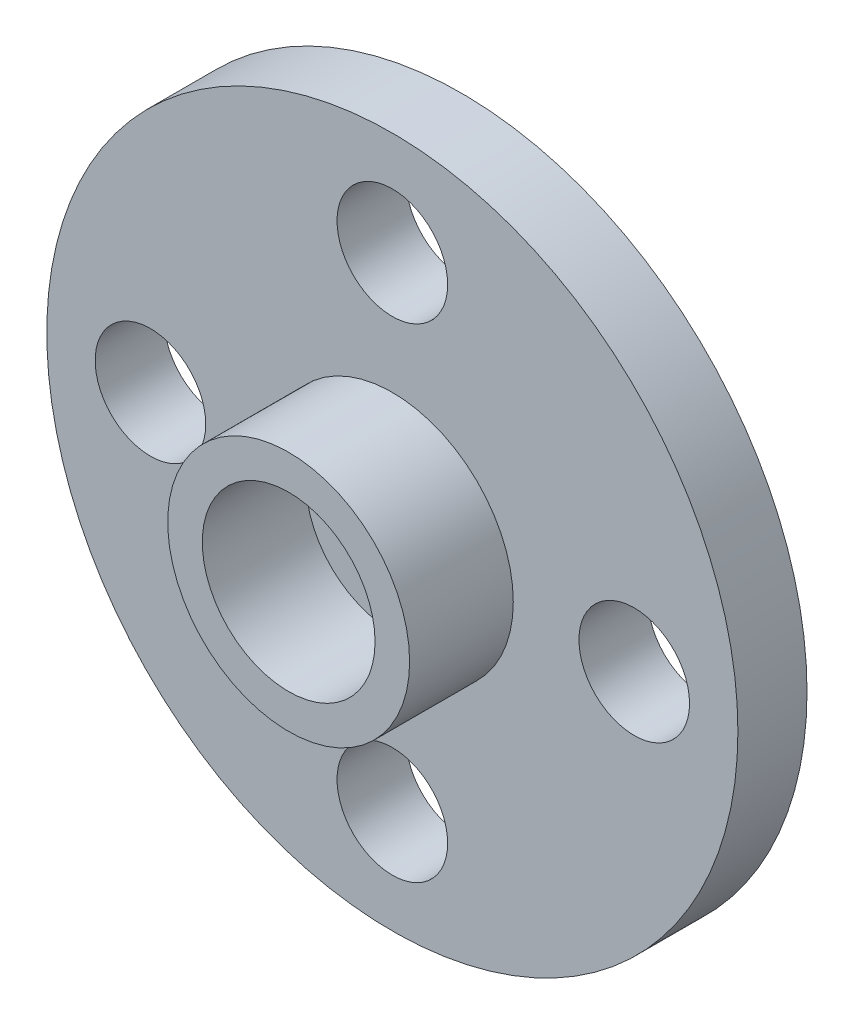
ISO-10303-21;
HEADER;
FILE_DESCRIPTION(('STEP AP214'),'2;1');
FILE_NAME('part.step','',(''),(''),'','','');
FILE_SCHEMA(('AUTOMOTIVE_DESIGN { 1 0 10303 214 1 1 1 1 }'));
ENDSEC;
DATA;
#1=APPLICATION_CONTEXT('core data for automotive mechanical design processes');
#2=APPLICATION_PROTOCOL_DEFINITION('international standard','automotive_design',2000,#1);
#3=PRODUCT_CONTEXT('',#1,'mechanical');
#4=PRODUCT('Part','Part','',(#3));
#5=PRODUCT_RELATED_PRODUCT_CATEGORY('part','',(#4));
#6=PRODUCT_DEFINITION_FORMATION('','',#4);
#7=PRODUCT_DEFINITION_CONTEXT('part definition',#1,'design');
#8=PRODUCT_DEFINITION('design','',#6,#7);
#9=PRODUCT_DEFINITION_SHAPE('','',#8);
#10=(LENGTH_UNIT() NAMED_UNIT(*) SI_UNIT(.MILLI.,.METRE.));
#11=(NAMED_UNIT(*) PLANE_ANGLE_UNIT() SI_UNIT($,.RADIAN.));
#12=(NAMED_UNIT(*) SI_UNIT($,.STERADIAN.) SOLID_ANGLE_UNIT());
#13=UNCERTAINTY_MEASURE_WITH_UNIT(LENGTH_MEASURE(1.E-05),#10,'distance_accuracy_value','');
#14=(GEOMETRIC_REPRESENTATION_CONTEXT(3) GLOBAL_UNCERTAINTY_ASSIGNED_CONTEXT((#13)) GLOBAL_UNIT_ASSIGNED_CONTEXT((#10,
#11,#12)) REPRESENTATION_CONTEXT('',''));
#15=CARTESIAN_POINT('',(0.,0.,0.));
#16=DIRECTION('',(0.,0.,1.));
#17=DIRECTION('',(1.,0.,0.));
#18=AXIS2_PLACEMENT_3D('',#15,#16,#17);
#19=CARTESIAN_POINT('',(0.,0.,2.));
#20=DIRECTION('',(0.,0.,1.));
#21=DIRECTION('',(1.,0.,0.));
#22=AXIS2_PLACEMENT_3D('',#19,#20,#21);
#23=PLANE('',#22);
#24=CARTESIAN_POINT('',(0.,0.,2.));
#25=DIRECTION('',(0.,0.,1.));
#26=DIRECTION('',(1.,0.,0.));
#27=AXIS2_PLACEMENT_3D('',#24,#25,#26);
#28=CIRCLE('',#27,3.5);
#29=CARTESIAN_POINT('',(3.5,0.,2.));
#30=VERTEX_POINT('',#29);
#31=EDGE_CURVE('E75',#30,#30,#28,.T.);
#32=ORIENTED_EDGE('',*,*,#31,.F.);
#33=EDGE_LOOP('',(#32));
#34=FACE_BOUND('',#33,.T.);
#35=CARTESIAN_POINT('',(-7.,0.,2.));
#36=DIRECTION('',(0.,0.,1.));
#37=DIRECTION('',(1.,0.,0.));
#38=AXIS2_PLACEMENT_3D('',#35,#36,#37);
#39=CIRCLE('',#38,1.6);
#40=CARTESIAN_POINT('',(-5.4,0.,2.));
#41=VERTEX_POINT('',#40);
#42=EDGE_CURVE('E60',#41,#41,#39,.T.);
#43=ORIENTED_EDGE('',*,*,#42,.F.);
#44=EDGE_LOOP('',(#43));
#45=FACE_BOUND('',#44,.T.);
#46=CARTESIAN_POINT('',(0.,7.,2.));
#47=DIRECTION('',(0.,0.,1.));
#48=DIRECTION('',(1.,0.,0.));
#49=AXIS2_PLACEMENT_3D('',#46,#47,#48);
#50=CIRCLE('',#49,1.6);
#51=CARTESIAN_POINT('',(1.6,7.,2.));
#52=VERTEX_POINT('',#51);
#53=EDGE_CURVE('E49',#52,#52,#50,.T.);
#54=ORIENTED_EDGE('',*,*,#53,.F.);
#55=EDGE_LOOP('',(#54));
#56=FACE_BOUND('',#55,.T.);
#57=CARTESIAN_POINT('',(0.,0.,2.));
#58=DIRECTION('',(0.,0.,1.));
#59=DIRECTION('',(1.,0.,0.));
#60=AXIS2_PLACEMENT_3D('',#57,#58,#59);
#61=CIRCLE('',#60,10.);
#62=CARTESIAN_POINT('',(10.,0.,2.));
#63=VERTEX_POINT('',#62);
#64=EDGE_CURVE('E40',#63,#63,#61,.T.);
#65=ORIENTED_EDGE('',*,*,#64,.T.);
#66=EDGE_LOOP('',(#65));
#67=FACE_BOUND('',#66,.T.);
#68=CARTESIAN_POINT('',(7.,0.,2.));
#69=DIRECTION('',(0.,0.,1.));
#70=DIRECTION('',(1.,0.,0.));
#71=AXIS2_PLACEMENT_3D('',#68,#69,#70);
#72=CIRCLE('',#71,1.6);
#73=CARTESIAN_POINT('',(8.6,0.,2.));
#74=VERTEX_POINT('',#73);
#75=EDGE_CURVE('E54',#74,#74,#72,.T.);
#76=ORIENTED_EDGE('',*,*,#75,.F.);
#77=EDGE_LOOP('',(#76));
#78=FACE_BOUND('',#77,.T.);
#79=CARTESIAN_POINT('',(0.,-7.,2.));
#80=DIRECTION('',(0.,0.,1.));
#81=DIRECTION('',(1.,0.,0.));
#82=AXIS2_PLACEMENT_3D('',#79,#80,#81);
#83=CIRCLE('',#82,1.6);
#84=CARTESIAN_POINT('',(1.6,-7.,2.));
#85=VERTEX_POINT('',#84);
#86=EDGE_CURVE('E66',#85,#85,#83,.T.);
#87=ORIENTED_EDGE('',*,*,#86,.F.);
#88=EDGE_LOOP('',(#87));
#89=FACE_BOUND('',#88,.T.);
#90=ADVANCED_FACE('F33',(#34,#45,#56,#67,#78,#89),#23,.T.);
#91=CARTESIAN_POINT('',(0.,0.,0.));
#92=DIRECTION('',(0.,0.,1.));
#93=DIRECTION('',(1.,0.,0.));
#94=AXIS2_PLACEMENT_3D('',#91,#92,#93);
#95=PLANE('',#94);
#96=CARTESIAN_POINT('',(0.,0.,0.));
#97=DIRECTION('',(0.,0.,1.));
#98=DIRECTION('',(1.,0.,0.));
#99=AXIS2_PLACEMENT_3D('',#96,#97,#98);
#100=CIRCLE('',#99,10.);
#101=CARTESIAN_POINT('',(10.,0.,0.));
#102=VERTEX_POINT('',#101);
#103=EDGE_CURVE('E44',#102,#102,#100,.T.);
#104=ORIENTED_EDGE('',*,*,#103,.F.);
#105=EDGE_LOOP('',(#104));
#106=FACE_BOUND('',#105,.T.);
#107=CARTESIAN_POINT('',(0.,7.,0.));
#108=DIRECTION('',(0.,0.,1.));
#109=DIRECTION('',(1.,0.,0.));
#110=AXIS2_PLACEMENT_3D('',#107,#108,#109);
#111=CIRCLE('',#110,1.6);
#112=CARTESIAN_POINT('',(1.6,7.,0.));
#113=VERTEX_POINT('',#112);
#114=EDGE_CURVE('E51',#113,#113,#111,.T.);
#115=ORIENTED_EDGE('',*,*,#114,.T.);
#116=EDGE_LOOP('',(#115));
#117=FACE_BOUND('',#116,.T.);
#118=CARTESIAN_POINT('',(7.,0.,0.));
#119=DIRECTION('',(0.,0.,1.));
#120=DIRECTION('',(1.,0.,0.));
#121=AXIS2_PLACEMENT_3D('',#118,#119,#120);
#122=CIRCLE('',#121,1.6);
#123=CARTESIAN_POINT('',(8.6,0.,0.));
#124=VERTEX_POINT('',#123);
#125=EDGE_CURVE('E57',#124,#124,#122,.T.);
#126=ORIENTED_EDGE('',*,*,#125,.T.);
#127=EDGE_LOOP('',(#126));
#128=FACE_BOUND('',#127,.T.);
#129=CARTESIAN_POINT('',(-7.,0.,0.));
#130=DIRECTION('',(0.,0.,1.));
#131=DIRECTION('',(1.,0.,0.));
#132=AXIS2_PLACEMENT_3D('',#129,#130,#131);
#133=CIRCLE('',#132,1.6);
#134=CARTESIAN_POINT('',(-5.4,0.,0.));
#135=VERTEX_POINT('',#134);
#136=EDGE_CURVE('E63',#135,#135,#133,.T.);
#137=ORIENTED_EDGE('',*,*,#136,.T.);
#138=EDGE_LOOP('',(#137));
#139=FACE_BOUND('',#138,.T.);
#140=CARTESIAN_POINT('',(0.,-7.,0.));
#141=DIRECTION('',(0.,0.,1.));
#142=DIRECTION('',(1.,0.,0.));
#143=AXIS2_PLACEMENT_3D('',#140,#141,#142);
#144=CIRCLE('',#143,1.6);
#145=CARTESIAN_POINT('',(1.6,-7.,0.));
#146=VERTEX_POINT('',#145);
#147=EDGE_CURVE('E69',#146,#146,#144,.T.);
#148=ORIENTED_EDGE('',*,*,#147,.T.);
#149=EDGE_LOOP('',(#148));
#150=FACE_BOUND('',#149,.T.);
#151=ADVANCED_FACE('F103',(#106,#117,#128,#139,#150),#95,.F.);
#152=CARTESIAN_POINT('',(0.,0.,2.));
#153=DIRECTION('',(0.,0.,-1.));
#154=DIRECTION('',(-1.,0.,0.));
#155=AXIS2_PLACEMENT_3D('',#152,#153,#154);
#156=CYLINDRICAL_SURFACE('',#155,10.);
#157=ORIENTED_EDGE('',*,*,#64,.F.);
#158=EDGE_LOOP('',(#157));
#159=FACE_BOUND('',#158,.T.);
#160=ORIENTED_EDGE('',*,*,#103,.T.);
#161=EDGE_LOOP('',(#160));
#162=FACE_BOUND('',#161,.T.);
#163=ADVANCED_FACE('F35',(#159,#162),#156,.T.);
#164=CARTESIAN_POINT('',(0.,7.,2.));
#165=DIRECTION('',(0.,0.,-1.));
#166=DIRECTION('',(-1.,0.,0.));
#167=AXIS2_PLACEMENT_3D('',#164,#165,#166);
#168=CYLINDRICAL_SURFACE('',#167,1.6);
#169=ORIENTED_EDGE('',*,*,#53,.T.);
#170=EDGE_LOOP('',(#169));
#171=FACE_BOUND('',#170,.T.);
#172=ORIENTED_EDGE('',*,*,#114,.F.);
#173=EDGE_LOOP('',(#172));
#174=FACE_BOUND('',#173,.T.);
#175=ADVANCED_FACE('F160',(#171,#174),#168,.F.);
#176=CARTESIAN_POINT('',(7.,0.,2.));
#177=DIRECTION('',(0.,0.,-1.));
#178=DIRECTION('',(-1.,0.,0.));
#179=AXIS2_PLACEMENT_3D('',#176,#177,#178);
#180=CYLINDRICAL_SURFACE('',#179,1.6);
#181=ORIENTED_EDGE('',*,*,#75,.T.);
#182=EDGE_LOOP('',(#181));
#183=FACE_BOUND('',#182,.T.);
#184=ORIENTED_EDGE('',*,*,#125,.F.);
#185=EDGE_LOOP('',(#184));
#186=FACE_BOUND('',#185,.T.);
#187=ADVANCED_FACE('F150',(#183,#186),#180,.F.);
#188=CARTESIAN_POINT('',(-7.,0.,2.));
#189=DIRECTION('',(0.,0.,-1.));
#190=DIRECTION('',(-1.,0.,0.));
#191=AXIS2_PLACEMENT_3D('',#188,#189,#190);
#192=CYLINDRICAL_SURFACE('',#191,1.6);
#193=ORIENTED_EDGE('',*,*,#42,.T.);
#194=EDGE_LOOP('',(#193));
#195=FACE_BOUND('',#194,.T.);
#196=ORIENTED_EDGE('',*,*,#136,.F.);
#197=EDGE_LOOP('',(#196));
#198=FACE_BOUND('',#197,.T.);
#199=ADVANCED_FACE('F98',(#195,#198),#192,.F.);
#200=CARTESIAN_POINT('',(0.,-7.,2.));
#201=DIRECTION('',(0.,0.,-1.));
#202=DIRECTION('',(-1.,0.,0.));
#203=AXIS2_PLACEMENT_3D('',#200,#201,#202);
#204=CYLINDRICAL_SURFACE('',#203,1.6);
#205=ORIENTED_EDGE('',*,*,#86,.T.);
#206=EDGE_LOOP('',(#205));
#207=FACE_BOUND('',#206,.T.);
#208=ORIENTED_EDGE('',*,*,#147,.F.);
#209=EDGE_LOOP('',(#208));
#210=FACE_BOUND('',#209,.T.);
#211=ADVANCED_FACE('F89',(#207,#210),#204,.F.);
#212=CARTESIAN_POINT('',(0.,0.,5.));
#213=DIRECTION('',(0.,0.,1.));
#214=DIRECTION('',(1.,0.,0.));
#215=AXIS2_PLACEMENT_3D('',#212,#213,#214);
#216=PLANE('',#215);
#217=CARTESIAN_POINT('',(0.,0.,5.));
#218=DIRECTION('',(0.,0.,1.));
#219=DIRECTION('',(1.,0.,0.));
#220=AXIS2_PLACEMENT_3D('',#217,#218,#219);
#221=CIRCLE('',#220,3.5);
#222=CARTESIAN_POINT('',(3.5,0.,5.));
#223=VERTEX_POINT('',#222);
#224=EDGE_CURVE('E72',#223,#223,#221,.T.);
#225=ORIENTED_EDGE('',*,*,#224,.T.);
#226=EDGE_LOOP('',(#225));
#227=FACE_BOUND('',#226,.T.);
#228=CARTESIAN_POINT('',(0.,0.,5.));
#229=DIRECTION('',(0.,0.,1.));
#230=DIRECTION('',(1.,0.,0.));
#231=AXIS2_PLACEMENT_3D('',#228,#229,#230);
#232=CIRCLE('',#231,2.5);
#233=CARTESIAN_POINT('',(2.5,0.,5.));
#234=VERTEX_POINT('',#233);
#235=EDGE_CURVE('E78',#234,#234,#232,.T.);
#236=ORIENTED_EDGE('',*,*,#235,.F.);
#237=EDGE_LOOP('',(#236));
#238=FACE_BOUND('',#237,.T.);
#239=ADVANCED_FACE('F86',(#227,#238),#216,.T.);
#240=CARTESIAN_POINT('',(0.,0.,5.));
#241=DIRECTION('',(0.,0.,-1.));
#242=DIRECTION('',(-1.,0.,0.));
#243=AXIS2_PLACEMENT_3D('',#240,#241,#242);
#244=CYLINDRICAL_SURFACE('',#243,3.5);
#245=ORIENTED_EDGE('',*,*,#224,.F.);
#246=EDGE_LOOP('',(#245));
#247=FACE_BOUND('',#246,.T.);
#248=ORIENTED_EDGE('',*,*,#31,.T.);
#249=EDGE_LOOP('',(#248));
#250=FACE_BOUND('',#249,.T.);
#251=ADVANCED_FACE('F88',(#247,#250),#244,.T.);
#252=CARTESIAN_POINT('',(0.,0.,5.));
#253=DIRECTION('',(0.,0.,-1.));
#254=DIRECTION('',(-1.,0.,0.));
#255=AXIS2_PLACEMENT_3D('',#252,#253,#254);
#256=CYLINDRICAL_SURFACE('',#255,2.5);
#257=ORIENTED_EDGE('',*,*,#235,.T.);
#258=EDGE_LOOP('',(#257));
#259=FACE_BOUND('',#258,.T.);
#260=CARTESIAN_POINT('',(0.,0.,2.));
#261=DIRECTION('',(0.,0.,1.));
#262=DIRECTION('',(1.,0.,0.));
#263=AXIS2_PLACEMENT_3D('',#260,#261,#262);
#264=CIRCLE('',#263,2.5);
#265=CARTESIAN_POINT('',(2.5,0.,2.));
#266=VERTEX_POINT('',#265);
#267=EDGE_CURVE('E10',#266,#266,#264,.F.);
#268=ORIENTED_EDGE('',*,*,#267,.T.);
#269=EDGE_LOOP('',(#268));
#270=FACE_BOUND('',#269,.T.);
#271=ADVANCED_FACE('F84',(#259,#270),#256,.F.);
#272=ORIENTED_EDGE('',*,*,#267,.F.);
#273=EDGE_LOOP('',(#272));
#274=FACE_BOUND('',#273,.T.);
#275=ADVANCED_FACE('F106',(#274),#23,.T.);
#276=CLOSED_SHELL('',(#90,#151,#163,#175,#187,#199,#211,#239,#251,#271,#275));
#277=MANIFOLD_SOLID_BREP('B2',#276);
#278=ADVANCED_BREP_SHAPE_REPRESENTATION('',(#18,#277),#14);
#279=SHAPE_DEFINITION_REPRESENTATION(#9,#278);
ENDSEC;
END-ISO-10303-21;
